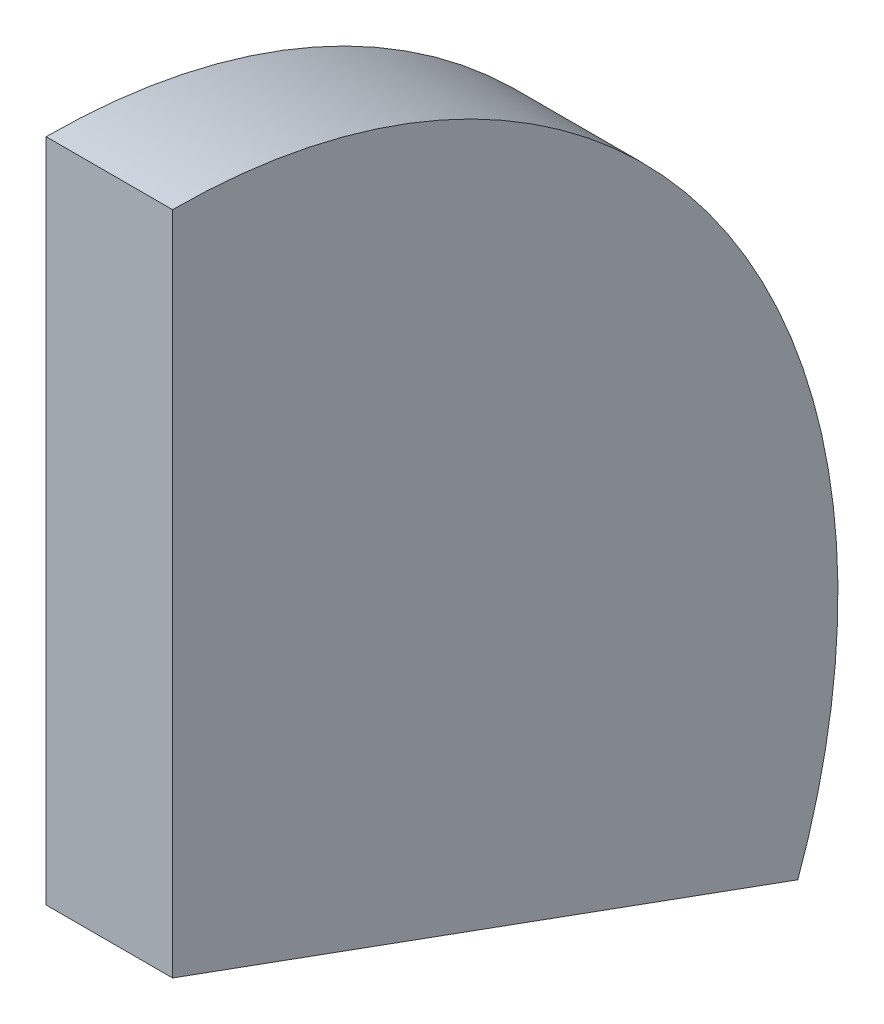
ISO-10303-21;
HEADER;
FILE_DESCRIPTION(('STEP AP214'),'2;1');
FILE_NAME('part.step','',(''),(''),'','','');
FILE_SCHEMA(('AUTOMOTIVE_DESIGN { 1 0 10303 214 1 1 1 1 }'));
ENDSEC;
DATA;
#1=APPLICATION_CONTEXT('core data for automotive mechanical design processes');
#2=APPLICATION_PROTOCOL_DEFINITION('international standard','automotive_design',2000,#1);
#3=PRODUCT_CONTEXT('',#1,'mechanical');
#4=PRODUCT('Part','Part','',(#3));
#5=PRODUCT_RELATED_PRODUCT_CATEGORY('part','',(#4));
#6=PRODUCT_DEFINITION_FORMATION('','',#4);
#7=PRODUCT_DEFINITION_CONTEXT('part definition',#1,'design');
#8=PRODUCT_DEFINITION('design','',#6,#7);
#9=PRODUCT_DEFINITION_SHAPE('','',#8);
#10=(LENGTH_UNIT() NAMED_UNIT(*) SI_UNIT(.MILLI.,.METRE.));
#11=(NAMED_UNIT(*) PLANE_ANGLE_UNIT() SI_UNIT($,.RADIAN.));
#12=(NAMED_UNIT(*) SI_UNIT($,.STERADIAN.) SOLID_ANGLE_UNIT());
#13=UNCERTAINTY_MEASURE_WITH_UNIT(LENGTH_MEASURE(1.E-05),#10,'distance_accuracy_value','');
#14=(GEOMETRIC_REPRESENTATION_CONTEXT(3) GLOBAL_UNCERTAINTY_ASSIGNED_CONTEXT((#13)) GLOBAL_UNIT_ASSIGNED_CONTEXT((#10,
#11,#12)) REPRESENTATION_CONTEXT('',''));
#15=CARTESIAN_POINT('',(0.,0.,0.));
#16=DIRECTION('',(0.,0.,1.));
#17=DIRECTION('',(1.,0.,0.));
#18=AXIS2_PLACEMENT_3D('',#15,#16,#17);
#19=CARTESIAN_POINT('',(270.5,0.,0.));
#20=DIRECTION('',(1.,0.,0.));
#21=DIRECTION('',(0.,0.,-1.));
#22=AXIS2_PLACEMENT_3D('',#19,#20,#21);
#23=CYLINDRICAL_SURFACE('',#22,100.);
#24=CARTESIAN_POINT('',(289.5,0.,0.));
#25=DIRECTION('',(1.,0.,0.));
#26=DIRECTION('',(0.,0.,-1.));
#27=AXIS2_PLACEMENT_3D('',#24,#25,#26);
#28=CIRCLE('',#27,100.);
#29=CARTESIAN_POINT('',(289.5,-34.2020143325669,-93.9692620785908));
#30=VERTEX_POINT('',#29);
#31=CARTESIAN_POINT('',(289.5,100.,0.));
#32=VERTEX_POINT('',#31);
#33=EDGE_CURVE('E75',#30,#32,#28,.T.);
#34=ORIENTED_EDGE('',*,*,#33,.F.);
#35=DIRECTION('',(1.,0.,0.));
#36=VECTOR('',#35,1.);
#37=CARTESIAN_POINT('',(270.5,-34.2020143325669,-93.9692620785908));
#38=LINE('',#37,#36);
#39=CARTESIAN_POINT('',(270.5,-34.2020143325669,-93.9692620785908));
#40=VERTEX_POINT('',#39);
#41=EDGE_CURVE('E58',#40,#30,#38,.T.);
#42=ORIENTED_EDGE('',*,*,#41,.F.);
#43=CARTESIAN_POINT('',(270.5,0.,0.));
#44=DIRECTION('',(1.,0.,0.));
#45=DIRECTION('',(0.,0.,-1.));
#46=AXIS2_PLACEMENT_3D('',#43,#44,#45);
#47=CIRCLE('',#46,100.);
#48=CARTESIAN_POINT('',(270.5,100.,0.));
#49=VERTEX_POINT('',#48);
#50=EDGE_CURVE('E78',#40,#49,#47,.T.);
#51=ORIENTED_EDGE('',*,*,#50,.T.);
#52=DIRECTION('',(1.,0.,0.));
#53=VECTOR('',#52,1.);
#54=CARTESIAN_POINT('',(270.5,100.,0.));
#55=LINE('',#54,#53);
#56=EDGE_CURVE('E11',#49,#32,#55,.T.);
#57=ORIENTED_EDGE('',*,*,#56,.T.);
#58=EDGE_LOOP('',(#34,#42,#51,#57));
#59=FACE_BOUND('',#58,.T.);
#60=ADVANCED_FACE('F17',(#59),#23,.T.);
#61=CARTESIAN_POINT('',(270.5,50.,0.));
#62=DIRECTION('',(0.,0.,-1.));
#63=DIRECTION('',(-1.,0.,0.));
#64=AXIS2_PLACEMENT_3D('',#61,#62,#63);
#65=PLANE('',#64);
#66=DIRECTION('',(0.,1.,0.));
#67=VECTOR('',#66,1.);
#68=CARTESIAN_POINT('',(289.5,50.,0.));
#69=LINE('',#68,#67);
#70=CARTESIAN_POINT('',(289.5,0.,1.52655665885959E-13));
#71=VERTEX_POINT('',#70);
#72=EDGE_CURVE('E87',#71,#32,#69,.T.);
#73=ORIENTED_EDGE('',*,*,#72,.T.);
#74=ORIENTED_EDGE('',*,*,#56,.F.);
#75=DIRECTION('',(0.,1.,0.));
#76=VECTOR('',#75,1.);
#77=CARTESIAN_POINT('',(270.5,50.,0.));
#78=LINE('',#77,#76);
#79=CARTESIAN_POINT('',(270.5,0.,1.52655665885959E-13));
#80=VERTEX_POINT('',#79);
#81=EDGE_CURVE('E72',#80,#49,#78,.T.);
#82=ORIENTED_EDGE('',*,*,#81,.F.);
#83=DIRECTION('',(1.,0.,0.));
#84=VECTOR('',#83,1.);
#85=CARTESIAN_POINT('',(270.5,0.,1.52655665885959E-13));
#86=LINE('',#85,#84);
#87=EDGE_CURVE('E21',#80,#71,#86,.T.);
#88=ORIENTED_EDGE('',*,*,#87,.T.);
#89=EDGE_LOOP('',(#73,#74,#82,#88));
#90=FACE_BOUND('',#89,.T.);
#91=ADVANCED_FACE('F19',(#90),#65,.F.);
#92=CARTESIAN_POINT('',(270.5,-17.1010071662834,-46.9846310392954));
#93=DIRECTION('',(0.,-0.939692620785909,0.342020143325669));
#94=DIRECTION('',(0.,-0.342020143325669,-0.939692620785909));
#95=AXIS2_PLACEMENT_3D('',#92,#93,#94);
#96=PLANE('',#95);
#97=DIRECTION('',(0.,-0.342020143325669,-0.939692620785908));
#98=VECTOR('',#97,1.);
#99=CARTESIAN_POINT('',(289.5,-17.1010071662834,-46.9846310392954));
#100=LINE('',#99,#98);
#101=EDGE_CURVE('E70',#71,#30,#100,.T.);
#102=ORIENTED_EDGE('',*,*,#101,.F.);
#103=ORIENTED_EDGE('',*,*,#87,.F.);
#104=DIRECTION('',(0.,-0.342020143325669,-0.939692620785908));
#105=VECTOR('',#104,1.);
#106=CARTESIAN_POINT('',(270.5,-17.1010071662834,-46.9846310392954));
#107=LINE('',#106,#105);
#108=EDGE_CURVE('E68',#80,#40,#107,.T.);
#109=ORIENTED_EDGE('',*,*,#108,.T.);
#110=ORIENTED_EDGE('',*,*,#41,.T.);
#111=EDGE_LOOP('',(#102,#103,#109,#110));
#112=FACE_BOUND('',#111,.T.);
#113=ADVANCED_FACE('F66',(#112),#96,.T.);
#114=CARTESIAN_POINT('',(270.5,32.8989928337166,-50.));
#115=DIRECTION('',(1.,0.,0.));
#116=DIRECTION('',(0.,1.,0.));
#117=AXIS2_PLACEMENT_3D('',#114,#115,#116);
#118=PLANE('',#117);
#119=ORIENTED_EDGE('',*,*,#50,.F.);
#120=ORIENTED_EDGE('',*,*,#108,.F.);
#121=ORIENTED_EDGE('',*,*,#81,.T.);
#122=EDGE_LOOP('',(#119,#120,#121));
#123=FACE_BOUND('',#122,.T.);
#124=ADVANCED_FACE('F77',(#123),#118,.F.);
#125=CARTESIAN_POINT('',(289.5,32.8989928337166,-50.));
#126=DIRECTION('',(1.,0.,0.));
#127=DIRECTION('',(0.,1.,0.));
#128=AXIS2_PLACEMENT_3D('',#125,#126,#127);
#129=PLANE('',#128);
#130=ORIENTED_EDGE('',*,*,#33,.T.);
#131=ORIENTED_EDGE('',*,*,#72,.F.);
#132=ORIENTED_EDGE('',*,*,#101,.T.);
#133=EDGE_LOOP('',(#130,#131,#132));
#134=FACE_BOUND('',#133,.T.);
#135=ADVANCED_FACE('F101',(#134),#129,.T.);
#136=CLOSED_SHELL('',(#60,#91,#113,#124,#135));
#137=MANIFOLD_SOLID_BREP('B1',#136);
#138=ADVANCED_BREP_SHAPE_REPRESENTATION('',(#18,#137),#14);
#139=SHAPE_DEFINITION_REPRESENTATION(#9,#138);
ENDSEC;
END-ISO-10303-21;
